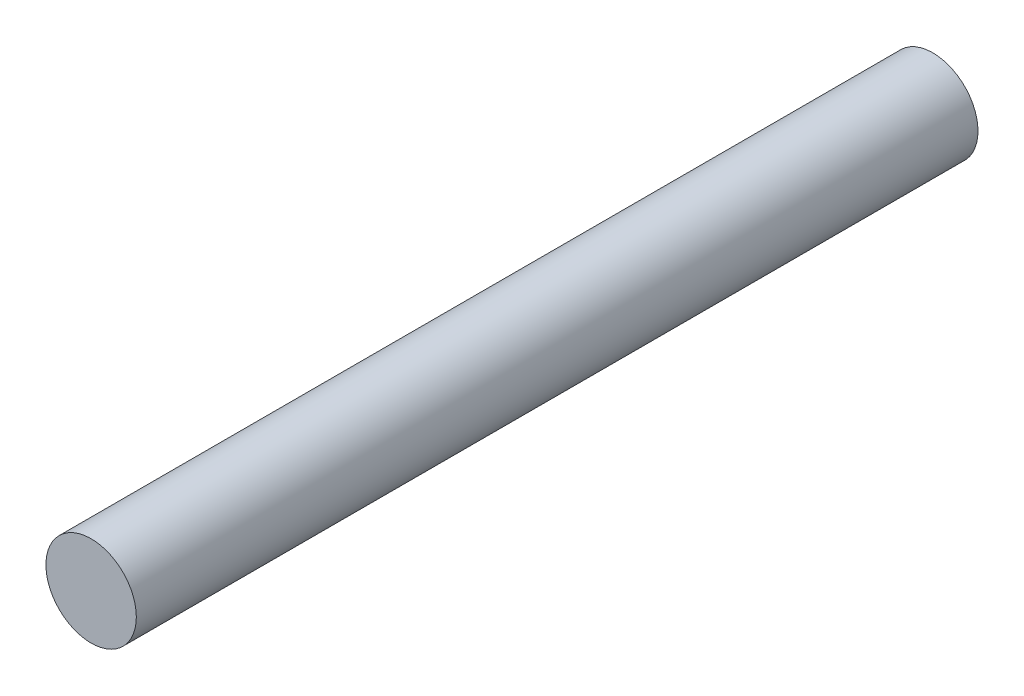
ISO-10303-21;
HEADER;
FILE_DESCRIPTION(('STEP AP214'),'2;1');
FILE_NAME('part.step','',(''),(''),'','','');
FILE_SCHEMA(('AUTOMOTIVE_DESIGN { 1 0 10303 214 1 1 1 1 }'));
ENDSEC;
DATA;
#1=APPLICATION_CONTEXT('core data for automotive mechanical design processes');
#2=APPLICATION_PROTOCOL_DEFINITION('international standard','automotive_design',2000,#1);
#3=PRODUCT_CONTEXT('',#1,'mechanical');
#4=PRODUCT('Part','Part','',(#3));
#5=PRODUCT_RELATED_PRODUCT_CATEGORY('part','',(#4));
#6=PRODUCT_DEFINITION_FORMATION('','',#4);
#7=PRODUCT_DEFINITION_CONTEXT('part definition',#1,'design');
#8=PRODUCT_DEFINITION('design','',#6,#7);
#9=PRODUCT_DEFINITION_SHAPE('','',#8);
#10=(LENGTH_UNIT() NAMED_UNIT(*) SI_UNIT(.MILLI.,.METRE.));
#11=(NAMED_UNIT(*) PLANE_ANGLE_UNIT() SI_UNIT($,.RADIAN.));
#12=(NAMED_UNIT(*) SI_UNIT($,.STERADIAN.) SOLID_ANGLE_UNIT());
#13=UNCERTAINTY_MEASURE_WITH_UNIT(LENGTH_MEASURE(1.E-05),#10,'distance_accuracy_value','');
#14=(GEOMETRIC_REPRESENTATION_CONTEXT(3) GLOBAL_UNCERTAINTY_ASSIGNED_CONTEXT((#13)) GLOBAL_UNIT_ASSIGNED_CONTEXT((#10,
#11,#12)) REPRESENTATION_CONTEXT('',''));
#15=CARTESIAN_POINT('',(0.,0.,0.));
#16=DIRECTION('',(0.,0.,1.));
#17=DIRECTION('',(1.,0.,0.));
#18=AXIS2_PLACEMENT_3D('',#15,#16,#17);
#19=CARTESIAN_POINT('',(0.,0.,55.85500005));
#20=DIRECTION('',(0.,0.,-1.));
#21=DIRECTION('',(-1.,0.,0.));
#22=AXIS2_PLACEMENT_3D('',#19,#20,#21);
#23=CYLINDRICAL_SURFACE('',#22,3.);
#24=CARTESIAN_POINT('',(0.,0.,55.85500005));
#25=DIRECTION('',(0.,0.,1.));
#26=DIRECTION('',(1.,0.,0.));
#27=AXIS2_PLACEMENT_3D('',#24,#25,#26);
#28=CIRCLE('',#27,3.);
#29=CARTESIAN_POINT('',(3.,0.,55.85500005));
#30=VERTEX_POINT('',#29);
#31=EDGE_CURVE('E10',#30,#30,#28,.T.);
#32=ORIENTED_EDGE('',*,*,#31,.F.);
#33=EDGE_LOOP('',(#32));
#34=FACE_BOUND('',#33,.T.);
#35=CARTESIAN_POINT('',(0.,0.,0.));
#36=DIRECTION('',(0.,0.,1.));
#37=DIRECTION('',(1.,0.,0.));
#38=AXIS2_PLACEMENT_3D('',#35,#36,#37);
#39=CIRCLE('',#38,3.);
#40=CARTESIAN_POINT('',(3.,0.,0.));
#41=VERTEX_POINT('',#40);
#42=EDGE_CURVE('E46',#41,#41,#39,.T.);
#43=ORIENTED_EDGE('',*,*,#42,.T.);
#44=EDGE_LOOP('',(#43));
#45=FACE_BOUND('',#44,.T.);
#46=ADVANCED_FACE('F43',(#34,#45),#23,.T.);
#47=CARTESIAN_POINT('',(0.,0.,55.85500005));
#48=DIRECTION('',(0.,0.,1.));
#49=DIRECTION('',(1.,0.,0.));
#50=AXIS2_PLACEMENT_3D('',#47,#48,#49);
#51=PLANE('',#50);
#52=ORIENTED_EDGE('',*,*,#31,.T.);
#53=EDGE_LOOP('',(#52));
#54=FACE_BOUND('',#53,.T.);
#55=ADVANCED_FACE('F58',(#54),#51,.T.);
#56=CARTESIAN_POINT('',(0.,0.,0.));
#57=DIRECTION('',(0.,0.,1.));
#58=DIRECTION('',(1.,0.,0.));
#59=AXIS2_PLACEMENT_3D('',#56,#57,#58);
#60=PLANE('',#59);
#61=ORIENTED_EDGE('',*,*,#42,.F.);
#62=EDGE_LOOP('',(#61));
#63=FACE_BOUND('',#62,.T.);
#64=ADVANCED_FACE('F59',(#63),#60,.F.);
#65=CLOSED_SHELL('',(#46,#55,#64));
#66=MANIFOLD_SOLID_BREP('B2',#65);
#67=ADVANCED_BREP_SHAPE_REPRESENTATION('',(#18,#66),#14);
#68=SHAPE_DEFINITION_REPRESENTATION(#9,#67);
ENDSEC;
END-ISO-10303-21;
